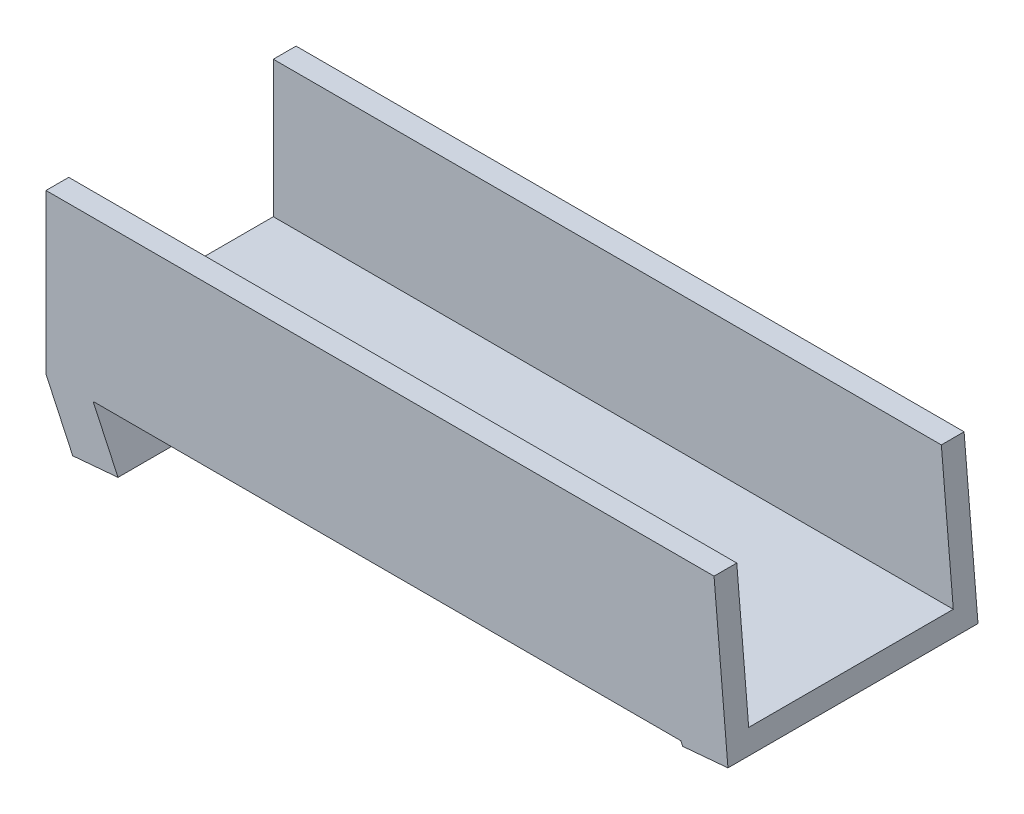
ISO-10303-21;
HEADER;
FILE_DESCRIPTION(('STEP AP214'),'2;1');
FILE_NAME('part.step','',(''),(''),'','','');
FILE_SCHEMA(('AUTOMOTIVE_DESIGN { 1 0 10303 214 1 1 1 1 }'));
ENDSEC;
DATA;
#1=APPLICATION_CONTEXT('core data for automotive mechanical design processes');
#2=APPLICATION_PROTOCOL_DEFINITION('international standard','automotive_design',2000,#1);
#3=PRODUCT_CONTEXT('',#1,'mechanical');
#4=PRODUCT('Part','Part','',(#3));
#5=PRODUCT_RELATED_PRODUCT_CATEGORY('part','',(#4));
#6=PRODUCT_DEFINITION_FORMATION('','',#4);
#7=PRODUCT_DEFINITION_CONTEXT('part definition',#1,'design');
#8=PRODUCT_DEFINITION('design','',#6,#7);
#9=PRODUCT_DEFINITION_SHAPE('','',#8);
#10=(LENGTH_UNIT() NAMED_UNIT(*) SI_UNIT(.MILLI.,.METRE.));
#11=(NAMED_UNIT(*) PLANE_ANGLE_UNIT() SI_UNIT($,.RADIAN.));
#12=(NAMED_UNIT(*) SI_UNIT($,.STERADIAN.) SOLID_ANGLE_UNIT());
#13=UNCERTAINTY_MEASURE_WITH_UNIT(LENGTH_MEASURE(1.E-05),#10,'distance_accuracy_value','');
#14=(GEOMETRIC_REPRESENTATION_CONTEXT(3) GLOBAL_UNCERTAINTY_ASSIGNED_CONTEXT((#13)) GLOBAL_UNIT_ASSIGNED_CONTEXT((#10,
#11,#12)) REPRESENTATION_CONTEXT('',''));
#15=CARTESIAN_POINT('',(0.,0.,0.));
#16=DIRECTION('',(0.,0.,1.));
#17=DIRECTION('',(1.,0.,0.));
#18=AXIS2_PLACEMENT_3D('',#15,#16,#17);
#19=CARTESIAN_POINT('',(0.,5.,0.));
#20=DIRECTION('',(0.,-1.,0.));
#21=DIRECTION('',(0.,0.,-1.));
#22=AXIS2_PLACEMENT_3D('',#19,#20,#21);
#23=PLANE('',#22);
#24=DIRECTION('',(-1.,0.,0.));
#25=VECTOR('',#24,1.);
#26=CARTESIAN_POINT('',(0.,5.,-5.));
#27=LINE('',#26,#25);
#28=CARTESIAN_POINT('',(149.56255668237,5.,-5.));
#29=VERTEX_POINT('',#28);
#30=CARTESIAN_POINT('',(0.,5.,-5.));
#31=VERTEX_POINT('',#30);
#32=EDGE_CURVE('E203',#29,#31,#27,.T.);
#33=ORIENTED_EDGE('',*,*,#32,.F.);
#34=DIRECTION('',(0.,0.,-1.));
#35=VECTOR('',#34,1.);
#36=CARTESIAN_POINT('',(149.56255668237,5.,0.));
#37=LINE('',#36,#35);
#38=CARTESIAN_POINT('',(149.56255668237,5.,-50.));
#39=VERTEX_POINT('',#38);
#40=EDGE_CURVE('E261',#29,#39,#37,.T.);
#41=ORIENTED_EDGE('',*,*,#40,.T.);
#42=DIRECTION('',(1.,0.,0.));
#43=VECTOR('',#42,1.);
#44=CARTESIAN_POINT('',(0.,5.,-50.));
#45=LINE('',#44,#43);
#46=CARTESIAN_POINT('',(0.,5.,-50.));
#47=VERTEX_POINT('',#46);
#48=EDGE_CURVE('E172',#47,#39,#45,.T.);
#49=ORIENTED_EDGE('',*,*,#48,.F.);
#50=DIRECTION('',(0.,0.,1.));
#51=VECTOR('',#50,1.);
#52=CARTESIAN_POINT('',(0.,5.,0.));
#53=LINE('',#52,#51);
#54=EDGE_CURVE('E177',#47,#31,#53,.T.);
#55=ORIENTED_EDGE('',*,*,#54,.T.);
#56=EDGE_LOOP('',(#33,#41,#49,#55));
#57=FACE_BOUND('',#56,.T.);
#58=ADVANCED_FACE('F39',(#57),#23,.F.);
#59=CARTESIAN_POINT('',(0.,5.,0.));
#60=DIRECTION('',(1.,0.,0.));
#61=DIRECTION('',(0.,0.,-1.));
#62=AXIS2_PLACEMENT_3D('',#59,#60,#61);
#63=PLANE('',#62);
#64=DIRECTION('',(0.,0.,1.));
#65=VECTOR('',#64,1.);
#66=CARTESIAN_POINT('',(0.,0.,0.));
#67=LINE('',#66,#65);
#68=CARTESIAN_POINT('',(0.,0.,-55.));
#69=VERTEX_POINT('',#68);
#70=CARTESIAN_POINT('',(0.,0.,0.));
#71=VERTEX_POINT('',#70);
#72=EDGE_CURVE('E166',#69,#71,#67,.T.);
#73=ORIENTED_EDGE('',*,*,#72,.T.);
#74=DIRECTION('',(0.,-1.,0.));
#75=VECTOR('',#74,1.);
#76=CARTESIAN_POINT('',(0.,5.,0.));
#77=LINE('',#76,#75);
#78=CARTESIAN_POINT('',(0.,35.,0.));
#79=VERTEX_POINT('',#78);
#80=EDGE_CURVE('E11',#79,#71,#77,.T.);
#81=ORIENTED_EDGE('',*,*,#80,.F.);
#82=DIRECTION('',(0.,0.,1.));
#83=VECTOR('',#82,1.);
#84=CARTESIAN_POINT('',(0.,35.,0.));
#85=LINE('',#84,#83);
#86=CARTESIAN_POINT('',(0.,35.,-5.));
#87=VERTEX_POINT('',#86);
#88=EDGE_CURVE('E245',#87,#79,#85,.T.);
#89=ORIENTED_EDGE('',*,*,#88,.F.);
#90=DIRECTION('',(0.,-1.,0.));
#91=VECTOR('',#90,1.);
#92=CARTESIAN_POINT('',(0.,35.,-5.));
#93=LINE('',#92,#91);
#94=EDGE_CURVE('E175',#87,#31,#93,.T.);
#95=ORIENTED_EDGE('',*,*,#94,.T.);
#96=ORIENTED_EDGE('',*,*,#54,.F.);
#97=DIRECTION('',(0.,-1.,0.));
#98=VECTOR('',#97,1.);
#99=CARTESIAN_POINT('',(0.,35.,-50.));
#100=LINE('',#99,#98);
#101=CARTESIAN_POINT('',(0.,35.,-50.));
#102=VERTEX_POINT('',#101);
#103=EDGE_CURVE('E161',#102,#47,#100,.T.);
#104=ORIENTED_EDGE('',*,*,#103,.F.);
#105=DIRECTION('',(0.,0.,1.));
#106=VECTOR('',#105,1.);
#107=CARTESIAN_POINT('',(0.,35.,-55.));
#108=LINE('',#107,#106);
#109=CARTESIAN_POINT('',(0.,35.,-55.));
#110=VERTEX_POINT('',#109);
#111=EDGE_CURVE('E168',#110,#102,#108,.T.);
#112=ORIENTED_EDGE('',*,*,#111,.F.);
#113=DIRECTION('',(0.,-1.,0.));
#114=VECTOR('',#113,1.);
#115=CARTESIAN_POINT('',(0.,5.,-55.));
#116=LINE('',#115,#114);
#117=EDGE_CURVE('E48',#110,#69,#116,.T.);
#118=ORIENTED_EDGE('',*,*,#117,.T.);
#119=EDGE_LOOP('',(#73,#81,#89,#95,#96,#104,#112,#118));
#120=FACE_BOUND('',#119,.T.);
#121=ADVANCED_FACE('F41',(#120),#63,.F.);
#122=CARTESIAN_POINT('',(0.,5.,0.));
#123=DIRECTION('',(0.,0.,-1.));
#124=DIRECTION('',(-1.,0.,0.));
#125=AXIS2_PLACEMENT_3D('',#122,#123,#124);
#126=PLANE('',#125);
#127=DIRECTION('',(0.996194698091745,0.0871557427476665,0.));
#128=VECTOR('',#127,1.);
#129=CARTESIAN_POINT('',(150.,0.,0.));
#130=LINE('',#129,#128);
#131=CARTESIAN_POINT('',(140.038053019083,-0.871557427476665,0.));
#132=VERTEX_POINT('',#131);
#133=CARTESIAN_POINT('',(150.,0.,0.));
#134=VERTEX_POINT('',#133);
#135=EDGE_CURVE('E266',#132,#134,#130,.T.);
#136=ORIENTED_EDGE('',*,*,#135,.T.);
#137=DIRECTION('',(0.0871557427476509,-0.996194698091746,0.));
#138=VECTOR('',#137,1.);
#139=CARTESIAN_POINT('',(150.,0.,0.));
#140=LINE('',#139,#138);
#141=CARTESIAN_POINT('',(146.937896776593,35.,0.));
#142=VERTEX_POINT('',#141);
#143=EDGE_CURVE('E145',#142,#134,#140,.T.);
#144=ORIENTED_EDGE('',*,*,#143,.F.);
#145=DIRECTION('',(1.,0.,0.));
#146=VECTOR('',#145,1.);
#147=CARTESIAN_POINT('',(0.,35.,0.));
#148=LINE('',#147,#146);
#149=EDGE_CURVE('E238',#79,#142,#148,.T.);
#150=ORIENTED_EDGE('',*,*,#149,.F.);
#151=ORIENTED_EDGE('',*,*,#80,.T.);
#152=DIRECTION('',(0.422618261740704,-0.906307787036648,0.));
#153=VECTOR('',#152,1.);
#154=CARTESIAN_POINT('',(0.,0.,0.));
#155=LINE('',#154,#153);
#156=CARTESIAN_POINT('',(5.87962611698491,-12.6088988978827,0.));
#157=VERTEX_POINT('',#156);
#158=EDGE_CURVE('E208',#71,#157,#155,.T.);
#159=ORIENTED_EDGE('',*,*,#158,.T.);
#160=DIRECTION('',(0.996194698091745,0.0871557427476664,0.));
#161=VECTOR('',#160,1.);
#162=CARTESIAN_POINT('',(5.87962611698491,-12.6088988978827,0.));
#163=LINE('',#162,#161);
#164=CARTESIAN_POINT('',(15.8415730979024,-11.737341470406,0.));
#165=VERTEX_POINT('',#164);
#166=EDGE_CURVE('E214',#157,#165,#163,.T.);
#167=ORIENTED_EDGE('',*,*,#166,.T.);
#168=DIRECTION('',(-0.422618261740704,0.906307787036648,0.));
#169=VECTOR('',#168,1.);
#170=CARTESIAN_POINT('',(15.8415730979024,-11.737341470406,0.));
#171=LINE('',#170,#169);
#172=CARTESIAN_POINT('',(10.3683608838717,0.,0.));
#173=VERTEX_POINT('',#172);
#174=EDGE_CURVE('E219',#165,#173,#171,.T.);
#175=ORIENTED_EDGE('',*,*,#174,.T.);
#176=DIRECTION('',(1.,0.,0.));
#177=VECTOR('',#176,1.);
#178=CARTESIAN_POINT('',(0.,0.,0.));
#179=LINE('',#178,#177);
#180=CARTESIAN_POINT('',(139.631639116128,0.,0.));
#181=VERTEX_POINT('',#180);
#182=EDGE_CURVE('E184',#173,#181,#179,.T.);
#183=ORIENTED_EDGE('',*,*,#182,.T.);
#184=DIRECTION('',(0.422618261740695,-0.906307787036652,0.));
#185=VECTOR('',#184,1.);
#186=CARTESIAN_POINT('',(140.038053019083,-0.871557427476665,0.));
#187=LINE('',#186,#185);
#188=EDGE_CURVE('E260',#181,#132,#187,.T.);
#189=ORIENTED_EDGE('',*,*,#188,.T.);
#190=EDGE_LOOP('',(#136,#144,#150,#151,#159,#167,#175,#183,#189));
#191=FACE_BOUND('',#190,.T.);
#192=ADVANCED_FACE('F289',(#191),#126,.F.);
#193=CARTESIAN_POINT('',(0.,5.,-55.));
#194=DIRECTION('',(0.,0.,1.));
#195=DIRECTION('',(1.,0.,0.));
#196=AXIS2_PLACEMENT_3D('',#193,#194,#195);
#197=PLANE('',#196);
#198=DIRECTION('',(-1.,0.,0.));
#199=VECTOR('',#198,1.);
#200=CARTESIAN_POINT('',(0.,35.,-55.));
#201=LINE('',#200,#199);
#202=CARTESIAN_POINT('',(146.937896776593,35.,-55.));
#203=VERTEX_POINT('',#202);
#204=EDGE_CURVE('E151',#203,#110,#201,.T.);
#205=ORIENTED_EDGE('',*,*,#204,.F.);
#206=DIRECTION('',(0.0871557427476509,-0.996194698091746,0.));
#207=VECTOR('',#206,1.);
#208=CARTESIAN_POINT('',(150.,0.,-55.));
#209=LINE('',#208,#207);
#210=CARTESIAN_POINT('',(150.,0.,-55.));
#211=VERTEX_POINT('',#210);
#212=EDGE_CURVE('E134',#203,#211,#209,.T.);
#213=ORIENTED_EDGE('',*,*,#212,.T.);
#214=DIRECTION('',(-0.996194698091745,-0.0871557427476665,0.));
#215=VECTOR('',#214,1.);
#216=CARTESIAN_POINT('',(150.,0.,-55.));
#217=LINE('',#216,#215);
#218=CARTESIAN_POINT('',(140.038053019083,-0.871557427476665,-55.));
#219=VERTEX_POINT('',#218);
#220=EDGE_CURVE('E221',#211,#219,#217,.T.);
#221=ORIENTED_EDGE('',*,*,#220,.T.);
#222=DIRECTION('',(-0.422618261740695,0.906307787036652,0.));
#223=VECTOR('',#222,1.);
#224=CARTESIAN_POINT('',(140.038053019083,-0.871557427476665,-55.));
#225=LINE('',#224,#223);
#226=CARTESIAN_POINT('',(139.631639116128,0.,-55.));
#227=VERTEX_POINT('',#226);
#228=EDGE_CURVE('E215',#219,#227,#225,.T.);
#229=ORIENTED_EDGE('',*,*,#228,.T.);
#230=DIRECTION('',(-1.,0.,0.));
#231=VECTOR('',#230,1.);
#232=CARTESIAN_POINT('',(0.,0.,-55.));
#233=LINE('',#232,#231);
#234=CARTESIAN_POINT('',(10.3683608838717,0.,-55.));
#235=VERTEX_POINT('',#234);
#236=EDGE_CURVE('E62',#227,#235,#233,.T.);
#237=ORIENTED_EDGE('',*,*,#236,.T.);
#238=DIRECTION('',(0.422618261740704,-0.906307787036648,0.));
#239=VECTOR('',#238,1.);
#240=CARTESIAN_POINT('',(15.8415730979024,-11.737341470406,-55.));
#241=LINE('',#240,#239);
#242=CARTESIAN_POINT('',(15.8415730979024,-11.737341470406,-55.));
#243=VERTEX_POINT('',#242);
#244=EDGE_CURVE('E204',#235,#243,#241,.T.);
#245=ORIENTED_EDGE('',*,*,#244,.T.);
#246=DIRECTION('',(-0.996194698091745,-0.0871557427476664,0.));
#247=VECTOR('',#246,1.);
#248=CARTESIAN_POINT('',(5.87962611698491,-12.6088988978827,-55.));
#249=LINE('',#248,#247);
#250=CARTESIAN_POINT('',(5.87962611698491,-12.6088988978827,-55.));
#251=VERTEX_POINT('',#250);
#252=EDGE_CURVE('E199',#243,#251,#249,.T.);
#253=ORIENTED_EDGE('',*,*,#252,.T.);
#254=DIRECTION('',(-0.422618261740704,0.906307787036648,0.));
#255=VECTOR('',#254,1.);
#256=CARTESIAN_POINT('',(0.,0.,-55.));
#257=LINE('',#256,#255);
#258=EDGE_CURVE('E197',#251,#69,#257,.T.);
#259=ORIENTED_EDGE('',*,*,#258,.T.);
#260=ORIENTED_EDGE('',*,*,#117,.F.);
#261=EDGE_LOOP('',(#205,#213,#221,#229,#237,#245,#253,#259,#260));
#262=FACE_BOUND('',#261,.T.);
#263=ADVANCED_FACE('F157',(#262),#197,.F.);
#264=CARTESIAN_POINT('',(0.,0.,0.));
#265=DIRECTION('',(0.,-1.,0.));
#266=DIRECTION('',(0.,0.,-1.));
#267=AXIS2_PLACEMENT_3D('',#264,#265,#266);
#268=PLANE('',#267);
#269=DIRECTION('',(0.,0.,1.));
#270=VECTOR('',#269,1.);
#271=CARTESIAN_POINT('',(139.631639116128,0.,-75.2469693937935));
#272=LINE('',#271,#270);
#273=EDGE_CURVE('E55',#227,#181,#272,.T.);
#274=ORIENTED_EDGE('',*,*,#273,.T.);
#275=ORIENTED_EDGE('',*,*,#182,.F.);
#276=DIRECTION('',(0.,0.,1.));
#277=VECTOR('',#276,1.);
#278=CARTESIAN_POINT('',(10.3683608838717,0.,-75.2469693937935));
#279=LINE('',#278,#277);
#280=EDGE_CURVE('E229',#235,#173,#279,.T.);
#281=ORIENTED_EDGE('',*,*,#280,.F.);
#282=ORIENTED_EDGE('',*,*,#236,.F.);
#283=EDGE_LOOP('',(#274,#275,#281,#282));
#284=FACE_BOUND('',#283,.T.);
#285=ADVANCED_FACE('F292',(#284),#268,.T.);
#286=CARTESIAN_POINT('',(0.,35.,-50.));
#287=DIRECTION('',(0.,0.,-1.));
#288=DIRECTION('',(-1.,0.,0.));
#289=AXIS2_PLACEMENT_3D('',#286,#287,#288);
#290=PLANE('',#289);
#291=ORIENTED_EDGE('',*,*,#48,.T.);
#292=DIRECTION('',(-0.0871557427476509,0.996194698091746,0.));
#293=VECTOR('',#292,1.);
#294=CARTESIAN_POINT('',(145.821738366745,47.7577490027324,-50.));
#295=LINE('',#294,#293);
#296=CARTESIAN_POINT('',(146.937896776593,35.,-50.));
#297=VERTEX_POINT('',#296);
#298=EDGE_CURVE('E257',#39,#297,#295,.T.);
#299=ORIENTED_EDGE('',*,*,#298,.T.);
#300=DIRECTION('',(1.,0.,0.));
#301=VECTOR('',#300,1.);
#302=CARTESIAN_POINT('',(0.,35.,-50.));
#303=LINE('',#302,#301);
#304=EDGE_CURVE('E153',#102,#297,#303,.T.);
#305=ORIENTED_EDGE('',*,*,#304,.F.);
#306=ORIENTED_EDGE('',*,*,#103,.T.);
#307=EDGE_LOOP('',(#291,#299,#305,#306));
#308=FACE_BOUND('',#307,.T.);
#309=ADVANCED_FACE('F256',(#308),#290,.F.);
#310=CARTESIAN_POINT('',(0.,35.,0.));
#311=DIRECTION('',(0.,1.,0.));
#312=DIRECTION('',(0.,0.,1.));
#313=AXIS2_PLACEMENT_3D('',#310,#311,#312);
#314=PLANE('',#313);
#315=DIRECTION('',(0.,0.,1.));
#316=VECTOR('',#315,1.);
#317=CARTESIAN_POINT('',(146.937896776593,35.,-55.));
#318=LINE('',#317,#316);
#319=EDGE_CURVE('E137',#203,#297,#318,.T.);
#320=ORIENTED_EDGE('',*,*,#319,.F.);
#321=ORIENTED_EDGE('',*,*,#204,.T.);
#322=ORIENTED_EDGE('',*,*,#111,.T.);
#323=ORIENTED_EDGE('',*,*,#304,.T.);
#324=EDGE_LOOP('',(#320,#321,#322,#323));
#325=FACE_BOUND('',#324,.T.);
#326=ADVANCED_FACE('F149',(#325),#314,.T.);
#327=CARTESIAN_POINT('',(0.,35.,-5.));
#328=DIRECTION('',(0.,0.,1.));
#329=DIRECTION('',(1.,0.,0.));
#330=AXIS2_PLACEMENT_3D('',#327,#328,#329);
#331=PLANE('',#330);
#332=DIRECTION('',(-1.,0.,0.));
#333=VECTOR('',#332,1.);
#334=CARTESIAN_POINT('',(0.,35.,-5.));
#335=LINE('',#334,#333);
#336=CARTESIAN_POINT('',(146.937896776593,35.,-5.));
#337=VERTEX_POINT('',#336);
#338=EDGE_CURVE('E242',#337,#87,#335,.T.);
#339=ORIENTED_EDGE('',*,*,#338,.F.);
#340=DIRECTION('',(0.0871557427476509,-0.996194698091746,0.));
#341=VECTOR('',#340,1.);
#342=CARTESIAN_POINT('',(145.821738366745,47.7577490027324,-5.));
#343=LINE('',#342,#341);
#344=EDGE_CURVE('E155',#337,#29,#343,.T.);
#345=ORIENTED_EDGE('',*,*,#344,.T.);
#346=ORIENTED_EDGE('',*,*,#32,.T.);
#347=ORIENTED_EDGE('',*,*,#94,.F.);
#348=EDGE_LOOP('',(#339,#345,#346,#347));
#349=FACE_BOUND('',#348,.T.);
#350=ADVANCED_FACE('F311',(#349),#331,.F.);
#351=CARTESIAN_POINT('',(0.,35.,0.));
#352=DIRECTION('',(0.,1.,0.));
#353=DIRECTION('',(0.,0.,1.));
#354=AXIS2_PLACEMENT_3D('',#351,#352,#353);
#355=PLANE('',#354);
#356=EDGE_CURVE('E144',#337,#142,#318,.T.);
#357=ORIENTED_EDGE('',*,*,#356,.F.);
#358=ORIENTED_EDGE('',*,*,#338,.T.);
#359=ORIENTED_EDGE('',*,*,#88,.T.);
#360=ORIENTED_EDGE('',*,*,#149,.T.);
#361=EDGE_LOOP('',(#357,#358,#359,#360));
#362=FACE_BOUND('',#361,.T.);
#363=ADVANCED_FACE('F314',(#362),#355,.T.);
#364=CARTESIAN_POINT('',(15.8415730979024,-11.737341470406,-75.2469693937935));
#365=DIRECTION('',(0.906307787036648,0.422618261740704,0.));
#366=DIRECTION('',(-0.422618261740704,0.906307787036648,0.));
#367=AXIS2_PLACEMENT_3D('',#364,#365,#366);
#368=PLANE('',#367);
#369=ORIENTED_EDGE('',*,*,#244,.F.);
#370=ORIENTED_EDGE('',*,*,#280,.T.);
#371=ORIENTED_EDGE('',*,*,#174,.F.);
#372=DIRECTION('',(0.,0.,1.));
#373=VECTOR('',#372,1.);
#374=CARTESIAN_POINT('',(15.8415730979024,-11.737341470406,-75.2469693937935));
#375=LINE('',#374,#373);
#376=EDGE_CURVE('E233',#243,#165,#375,.T.);
#377=ORIENTED_EDGE('',*,*,#376,.F.);
#378=EDGE_LOOP('',(#369,#370,#371,#377));
#379=FACE_BOUND('',#378,.T.);
#380=ADVANCED_FACE('F288',(#379),#368,.T.);
#381=CARTESIAN_POINT('',(5.87962611698491,-12.6088988978827,-75.2469693937935));
#382=DIRECTION('',(0.0871557427476664,-0.996194698091745,0.));
#383=DIRECTION('',(0.996194698091745,0.0871557427476664,0.));
#384=AXIS2_PLACEMENT_3D('',#381,#382,#383);
#385=PLANE('',#384);
#386=ORIENTED_EDGE('',*,*,#252,.F.);
#387=ORIENTED_EDGE('',*,*,#376,.T.);
#388=ORIENTED_EDGE('',*,*,#166,.F.);
#389=DIRECTION('',(0.,0.,1.));
#390=VECTOR('',#389,1.);
#391=CARTESIAN_POINT('',(5.87962611698491,-12.6088988978827,-75.2469693937935));
#392=LINE('',#391,#390);
#393=EDGE_CURVE('E209',#251,#157,#392,.T.);
#394=ORIENTED_EDGE('',*,*,#393,.F.);
#395=EDGE_LOOP('',(#386,#387,#388,#394));
#396=FACE_BOUND('',#395,.T.);
#397=ADVANCED_FACE('F286',(#396),#385,.T.);
#398=CARTESIAN_POINT('',(0.,0.,-75.2469693937935));
#399=DIRECTION('',(-0.906307787036648,-0.422618261740704,0.));
#400=DIRECTION('',(0.422618261740704,-0.906307787036648,0.));
#401=AXIS2_PLACEMENT_3D('',#398,#399,#400);
#402=PLANE('',#401);
#403=ORIENTED_EDGE('',*,*,#258,.F.);
#404=ORIENTED_EDGE('',*,*,#393,.T.);
#405=ORIENTED_EDGE('',*,*,#158,.F.);
#406=ORIENTED_EDGE('',*,*,#72,.F.);
#407=EDGE_LOOP('',(#403,#404,#405,#406));
#408=FACE_BOUND('',#407,.T.);
#409=ADVANCED_FACE('F206',(#408),#402,.T.);
#410=CARTESIAN_POINT('',(150.,0.,-75.2469693937935));
#411=DIRECTION('',(0.0871557427476665,-0.996194698091745,0.));
#412=DIRECTION('',(0.996194698091745,0.0871557427476665,0.));
#413=AXIS2_PLACEMENT_3D('',#410,#411,#412);
#414=PLANE('',#413);
#415=ORIENTED_EDGE('',*,*,#220,.F.);
#416=DIRECTION('',(0.,0.,-1.));
#417=VECTOR('',#416,1.);
#418=CARTESIAN_POINT('',(150.,0.,0.));
#419=LINE('',#418,#417);
#420=EDGE_CURVE('E140',#134,#211,#419,.T.);
#421=ORIENTED_EDGE('',*,*,#420,.F.);
#422=ORIENTED_EDGE('',*,*,#135,.F.);
#423=DIRECTION('',(0.,0.,1.));
#424=VECTOR('',#423,1.);
#425=CARTESIAN_POINT('',(140.038053019083,-0.871557427476665,-75.2469693937935));
#426=LINE('',#425,#424);
#427=EDGE_CURVE('E272',#219,#132,#426,.T.);
#428=ORIENTED_EDGE('',*,*,#427,.F.);
#429=EDGE_LOOP('',(#415,#421,#422,#428));
#430=FACE_BOUND('',#429,.T.);
#431=ADVANCED_FACE('F321',(#430),#414,.T.);
#432=CARTESIAN_POINT('',(140.038053019083,-0.871557427476665,-75.2469693937935));
#433=DIRECTION('',(-0.906307787036652,-0.422618261740695,0.));
#434=DIRECTION('',(0.422618261740695,-0.906307787036652,0.));
#435=AXIS2_PLACEMENT_3D('',#432,#433,#434);
#436=PLANE('',#435);
#437=ORIENTED_EDGE('',*,*,#228,.F.);
#438=ORIENTED_EDGE('',*,*,#427,.T.);
#439=ORIENTED_EDGE('',*,*,#188,.F.);
#440=ORIENTED_EDGE('',*,*,#273,.F.);
#441=EDGE_LOOP('',(#437,#438,#439,#440));
#442=FACE_BOUND('',#441,.T.);
#443=ADVANCED_FACE('F326',(#442),#436,.T.);
#444=CARTESIAN_POINT('',(150.,0.,-55.));
#445=DIRECTION('',(-0.996194698091746,-0.0871557427476509,0.));
#446=DIRECTION('',(0.0871557427476509,-0.996194698091746,0.));
#447=AXIS2_PLACEMENT_3D('',#444,#445,#446);
#448=PLANE('',#447);
#449=ORIENTED_EDGE('',*,*,#40,.F.);
#450=ORIENTED_EDGE('',*,*,#344,.F.);
#451=ORIENTED_EDGE('',*,*,#356,.T.);
#452=ORIENTED_EDGE('',*,*,#143,.T.);
#453=ORIENTED_EDGE('',*,*,#420,.T.);
#454=ORIENTED_EDGE('',*,*,#212,.F.);
#455=ORIENTED_EDGE('',*,*,#319,.T.);
#456=ORIENTED_EDGE('',*,*,#298,.F.);
#457=EDGE_LOOP('',(#449,#450,#451,#452,#453,#454,#455,#456));
#458=FACE_BOUND('',#457,.T.);
#459=ADVANCED_FACE('F136',(#458),#448,.F.);
#460=CLOSED_SHELL('',(#58,#121,#192,#263,#285,#309,#326,#350,#363,#380,#397,#409,#431,#443,#459));
#461=MANIFOLD_SOLID_BREP('B2',#460);
#462=ADVANCED_BREP_SHAPE_REPRESENTATION('',(#18,#461),#14);
#463=SHAPE_DEFINITION_REPRESENTATION(#9,#462);
ENDSEC;
END-ISO-10303-21;
